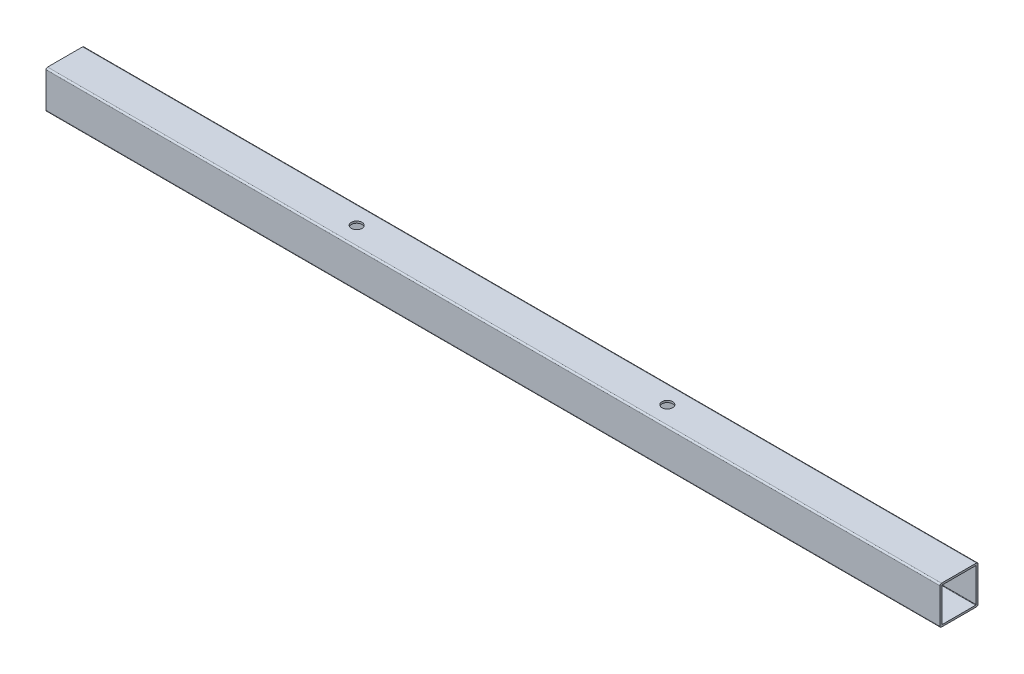
ISO-10303-21;
HEADER;
FILE_DESCRIPTION(('STEP AP214'),'2;1');
FILE_NAME('part.step','',(''),(''),'','','');
FILE_SCHEMA(('AUTOMOTIVE_DESIGN { 1 0 10303 214 1 1 1 1 }'));
ENDSEC;
DATA;
#1=APPLICATION_CONTEXT('core data for automotive mechanical design processes');
#2=APPLICATION_PROTOCOL_DEFINITION('international standard','automotive_design',2000,#1);
#3=PRODUCT_CONTEXT('',#1,'mechanical');
#4=PRODUCT('Part','Part','',(#3));
#5=PRODUCT_RELATED_PRODUCT_CATEGORY('part','',(#4));
#6=PRODUCT_DEFINITION_FORMATION('','',#4);
#7=PRODUCT_DEFINITION_CONTEXT('part definition',#1,'design');
#8=PRODUCT_DEFINITION('design','',#6,#7);
#9=PRODUCT_DEFINITION_SHAPE('','',#8);
#10=(LENGTH_UNIT() NAMED_UNIT(*) SI_UNIT(.MILLI.,.METRE.));
#11=(NAMED_UNIT(*) PLANE_ANGLE_UNIT() SI_UNIT($,.RADIAN.));
#12=(NAMED_UNIT(*) SI_UNIT($,.STERADIAN.) SOLID_ANGLE_UNIT());
#13=UNCERTAINTY_MEASURE_WITH_UNIT(LENGTH_MEASURE(1.E-05),#10,'distance_accuracy_value','');
#14=(GEOMETRIC_REPRESENTATION_CONTEXT(3) GLOBAL_UNCERTAINTY_ASSIGNED_CONTEXT((#13)) GLOBAL_UNIT_ASSIGNED_CONTEXT((#10,
#11,#12)) REPRESENTATION_CONTEXT('',''));
#15=CARTESIAN_POINT('',(0.,0.,0.));
#16=DIRECTION('',(0.,0.,1.));
#17=DIRECTION('',(1.,0.,0.));
#18=AXIS2_PLACEMENT_3D('',#15,#16,#17);
#19=CARTESIAN_POINT('',(-1275.,100.,825.));
#20=DIRECTION('',(0.,0.,-1.));
#21=DIRECTION('',(-1.,0.,0.));
#22=AXIS2_PLACEMENT_3D('',#19,#20,#21);
#23=PLANE('',#22);
#24=DIRECTION('',(1.,0.,0.));
#25=VECTOR('',#24,1.);
#26=CARTESIAN_POINT('',(1175.,96.,825.));
#27=LINE('',#26,#25);
#28=CARTESIAN_POINT('',(-1175.,96.,825.));
#29=VERTEX_POINT('',#28);
#30=CARTESIAN_POINT('',(1175.,96.,825.));
#31=VERTEX_POINT('',#30);
#32=EDGE_CURVE('E351',#29,#31,#27,.T.);
#33=ORIENTED_EDGE('',*,*,#32,.T.);
#34=DIRECTION('',(0.,1.,0.));
#35=VECTOR('',#34,1.);
#36=CARTESIAN_POINT('',(1175.,100.,825.));
#37=LINE('',#36,#35);
#38=CARTESIAN_POINT('',(1175.,4.,825.));
#39=VERTEX_POINT('',#38);
#40=EDGE_CURVE('E223',#31,#39,#37,.F.);
#41=ORIENTED_EDGE('',*,*,#40,.T.);
#42=DIRECTION('',(1.,0.,0.));
#43=VECTOR('',#42,1.);
#44=CARTESIAN_POINT('',(-1275.,4.,825.));
#45=LINE('',#44,#43);
#46=CARTESIAN_POINT('',(-1175.,4.,825.));
#47=VERTEX_POINT('',#46);
#48=EDGE_CURVE('E354',#39,#47,#45,.F.);
#49=ORIENTED_EDGE('',*,*,#48,.T.);
#50=DIRECTION('',(0.,1.,0.));
#51=VECTOR('',#50,1.);
#52=CARTESIAN_POINT('',(-1175.,100.,825.));
#53=LINE('',#52,#51);
#54=EDGE_CURVE('E230',#47,#29,#53,.T.);
#55=ORIENTED_EDGE('',*,*,#54,.T.);
#56=EDGE_LOOP('',(#33,#41,#49,#55));
#57=FACE_BOUND('',#56,.T.);
#58=ADVANCED_FACE('F19',(#57),#23,.T.);
#59=CARTESIAN_POINT('',(-1175.,100.,825.));
#60=DIRECTION('',(1.,0.,0.));
#61=DIRECTION('',(0.,0.,-1.));
#62=AXIS2_PLACEMENT_3D('',#59,#60,#61);
#63=PLANE('',#62);
#64=DIRECTION('',(0.,1.,0.));
#65=VECTOR('',#64,1.);
#66=CARTESIAN_POINT('',(-1175.,100.,830.));
#67=LINE('',#66,#65);
#68=CARTESIAN_POINT('',(-1175.,6.00000000000001,830.));
#69=VERTEX_POINT('',#68);
#70=CARTESIAN_POINT('',(-1175.,94.,830.));
#71=VERTEX_POINT('',#70);
#72=EDGE_CURVE('E244',#69,#71,#67,.T.);
#73=ORIENTED_EDGE('',*,*,#72,.T.);
#74=CARTESIAN_POINT('',(-1175.,94.,831.));
#75=DIRECTION('',(1.,0.,0.));
#76=DIRECTION('',(0.,0.,-1.));
#77=AXIS2_PLACEMENT_3D('',#74,#75,#76);
#78=CIRCLE('',#77,1.);
#79=CARTESIAN_POINT('',(-1175.,95.,831.));
#80=VERTEX_POINT('',#79);
#81=EDGE_CURVE('E318',#71,#80,#78,.T.);
#82=ORIENTED_EDGE('',*,*,#81,.T.);
#83=DIRECTION('',(0.,0.,1.));
#84=VECTOR('',#83,1.);
#85=CARTESIAN_POINT('',(-1175.,95.,825.));
#86=LINE('',#85,#84);
#87=CARTESIAN_POINT('',(-1175.,95.,919.));
#88=VERTEX_POINT('',#87);
#89=EDGE_CURVE('E242',#80,#88,#86,.T.);
#90=ORIENTED_EDGE('',*,*,#89,.T.);
#91=CARTESIAN_POINT('',(-1175.,94.,919.));
#92=DIRECTION('',(1.,0.,0.));
#93=DIRECTION('',(0.,0.,-1.));
#94=AXIS2_PLACEMENT_3D('',#91,#92,#93);
#95=CIRCLE('',#94,1.);
#96=CARTESIAN_POINT('',(-1175.,94.,920.));
#97=VERTEX_POINT('',#96);
#98=EDGE_CURVE('E324',#88,#97,#95,.T.);
#99=ORIENTED_EDGE('',*,*,#98,.T.);
#100=DIRECTION('',(0.,-1.,0.));
#101=VECTOR('',#100,1.);
#102=CARTESIAN_POINT('',(-1175.,100.,920.));
#103=LINE('',#102,#101);
#104=CARTESIAN_POINT('',(-1175.,6.00000000000001,920.));
#105=VERTEX_POINT('',#104);
#106=EDGE_CURVE('E239',#97,#105,#103,.T.);
#107=ORIENTED_EDGE('',*,*,#106,.T.);
#108=CARTESIAN_POINT('',(-1175.,6.,919.));
#109=DIRECTION('',(1.,0.,0.));
#110=DIRECTION('',(0.,0.,-1.));
#111=AXIS2_PLACEMENT_3D('',#108,#109,#110);
#112=CIRCLE('',#111,1.);
#113=CARTESIAN_POINT('',(-1175.,5.,919.));
#114=VERTEX_POINT('',#113);
#115=EDGE_CURVE('E330',#105,#114,#112,.T.);
#116=ORIENTED_EDGE('',*,*,#115,.T.);
#117=DIRECTION('',(0.,0.,-1.));
#118=VECTOR('',#117,1.);
#119=CARTESIAN_POINT('',(-1175.,5.,825.));
#120=LINE('',#119,#118);
#121=CARTESIAN_POINT('',(-1175.,5.,831.));
#122=VERTEX_POINT('',#121);
#123=EDGE_CURVE('E246',#114,#122,#120,.T.);
#124=ORIENTED_EDGE('',*,*,#123,.T.);
#125=CARTESIAN_POINT('',(-1175.,6.,831.));
#126=DIRECTION('',(1.,0.,0.));
#127=DIRECTION('',(0.,0.,-1.));
#128=AXIS2_PLACEMENT_3D('',#125,#126,#127);
#129=CIRCLE('',#128,1.);
#130=EDGE_CURVE('E12',#122,#69,#129,.T.);
#131=ORIENTED_EDGE('',*,*,#130,.T.);
#132=EDGE_LOOP('',(#73,#82,#90,#99,#107,#116,#124,#131));
#133=FACE_BOUND('',#132,.T.);
#134=DIRECTION('',(0.,0.,1.));
#135=VECTOR('',#134,1.);
#136=CARTESIAN_POINT('',(-1175.,0.,0.));
#137=LINE('',#136,#135);
#138=CARTESIAN_POINT('',(-1175.,0.,829.));
#139=VERTEX_POINT('',#138);
#140=CARTESIAN_POINT('',(-1175.,0.,921.));
#141=VERTEX_POINT('',#140);
#142=EDGE_CURVE('E138',#139,#141,#137,.T.);
#143=ORIENTED_EDGE('',*,*,#142,.T.);
#144=CARTESIAN_POINT('',(-1175.,4.,921.));
#145=DIRECTION('',(1.,0.,0.));
#146=DIRECTION('',(0.,0.,-1.));
#147=AXIS2_PLACEMENT_3D('',#144,#145,#146);
#148=CIRCLE('',#147,4.);
#149=CARTESIAN_POINT('',(-1175.,4.,925.));
#150=VERTEX_POINT('',#149);
#151=EDGE_CURVE('E133',#141,#150,#148,.F.);
#152=ORIENTED_EDGE('',*,*,#151,.T.);
#153=DIRECTION('',(0.,1.,0.));
#154=VECTOR('',#153,1.);
#155=CARTESIAN_POINT('',(-1175.,600.,925.));
#156=LINE('',#155,#154);
#157=CARTESIAN_POINT('',(-1175.,96.,925.));
#158=VERTEX_POINT('',#157);
#159=EDGE_CURVE('E136',#150,#158,#156,.T.);
#160=ORIENTED_EDGE('',*,*,#159,.T.);
#161=CARTESIAN_POINT('',(-1175.,96.,921.));
#162=DIRECTION('',(1.,0.,0.));
#163=DIRECTION('',(0.,0.,-1.));
#164=AXIS2_PLACEMENT_3D('',#161,#162,#163);
#165=CIRCLE('',#164,4.);
#166=CARTESIAN_POINT('',(-1175.,100.,921.));
#167=VERTEX_POINT('',#166);
#168=EDGE_CURVE('E143',#158,#167,#165,.F.);
#169=ORIENTED_EDGE('',*,*,#168,.T.);
#170=DIRECTION('',(0.,0.,-1.));
#171=VECTOR('',#170,1.);
#172=CARTESIAN_POINT('',(-1175.,100.,0.));
#173=LINE('',#172,#171);
#174=CARTESIAN_POINT('',(-1175.,100.,829.));
#175=VERTEX_POINT('',#174);
#176=EDGE_CURVE('E224',#167,#175,#173,.T.);
#177=ORIENTED_EDGE('',*,*,#176,.T.);
#178=CARTESIAN_POINT('',(-1175.,96.,829.));
#179=DIRECTION('',(1.,0.,0.));
#180=DIRECTION('',(0.,0.,-1.));
#181=AXIS2_PLACEMENT_3D('',#178,#179,#180);
#182=CIRCLE('',#181,4.);
#183=EDGE_CURVE('E360',#175,#29,#182,.F.);
#184=ORIENTED_EDGE('',*,*,#183,.T.);
#185=ORIENTED_EDGE('',*,*,#54,.F.);
#186=CARTESIAN_POINT('',(-1175.,4.,829.));
#187=DIRECTION('',(1.,0.,0.));
#188=DIRECTION('',(0.,0.,-1.));
#189=AXIS2_PLACEMENT_3D('',#186,#187,#188);
#190=CIRCLE('',#189,4.);
#191=EDGE_CURVE('E363',#47,#139,#190,.F.);
#192=ORIENTED_EDGE('',*,*,#191,.T.);
#193=EDGE_LOOP('',(#143,#152,#160,#169,#177,#184,#185,#192));
#194=FACE_BOUND('',#193,.T.);
#195=ADVANCED_FACE('F135',(#133,#194),#63,.F.);
#196=CARTESIAN_POINT('',(1175.,100.,-825.));
#197=DIRECTION('',(-1.,0.,0.));
#198=DIRECTION('',(0.,0.,1.));
#199=AXIS2_PLACEMENT_3D('',#196,#197,#198);
#200=PLANE('',#199);
#201=DIRECTION('',(0.,-1.,0.));
#202=VECTOR('',#201,1.);
#203=CARTESIAN_POINT('',(1175.,100.,830.));
#204=LINE('',#203,#202);
#205=CARTESIAN_POINT('',(1175.,94.,830.));
#206=VERTEX_POINT('',#205);
#207=CARTESIAN_POINT('',(1175.,6.00000000000001,830.));
#208=VERTEX_POINT('',#207);
#209=EDGE_CURVE('E216',#206,#208,#204,.T.);
#210=ORIENTED_EDGE('',*,*,#209,.T.);
#211=CARTESIAN_POINT('',(1175.,6.,831.));
#212=DIRECTION('',(-1.,0.,0.));
#213=DIRECTION('',(0.,0.,1.));
#214=AXIS2_PLACEMENT_3D('',#211,#212,#213);
#215=CIRCLE('',#214,1.);
#216=CARTESIAN_POINT('',(1175.,5.,831.));
#217=VERTEX_POINT('',#216);
#218=EDGE_CURVE('E27',#208,#217,#215,.T.);
#219=ORIENTED_EDGE('',*,*,#218,.T.);
#220=DIRECTION('',(0.,0.,1.));
#221=VECTOR('',#220,1.);
#222=CARTESIAN_POINT('',(1175.,5.,-825.));
#223=LINE('',#222,#221);
#224=CARTESIAN_POINT('',(1175.,5.,919.));
#225=VERTEX_POINT('',#224);
#226=EDGE_CURVE('E220',#217,#225,#223,.T.);
#227=ORIENTED_EDGE('',*,*,#226,.T.);
#228=CARTESIAN_POINT('',(1175.,6.,919.));
#229=DIRECTION('',(-1.,0.,0.));
#230=DIRECTION('',(0.,0.,1.));
#231=AXIS2_PLACEMENT_3D('',#228,#229,#230);
#232=CIRCLE('',#231,1.);
#233=CARTESIAN_POINT('',(1175.,6.00000000000001,920.));
#234=VERTEX_POINT('',#233);
#235=EDGE_CURVE('E332',#225,#234,#232,.T.);
#236=ORIENTED_EDGE('',*,*,#235,.T.);
#237=DIRECTION('',(0.,1.,0.));
#238=VECTOR('',#237,1.);
#239=CARTESIAN_POINT('',(1175.,100.,920.));
#240=LINE('',#239,#238);
#241=CARTESIAN_POINT('',(1175.,94.,920.));
#242=VERTEX_POINT('',#241);
#243=EDGE_CURVE('E163',#234,#242,#240,.T.);
#244=ORIENTED_EDGE('',*,*,#243,.T.);
#245=CARTESIAN_POINT('',(1175.,94.,919.));
#246=DIRECTION('',(-1.,0.,0.));
#247=DIRECTION('',(0.,0.,1.));
#248=AXIS2_PLACEMENT_3D('',#245,#246,#247);
#249=CIRCLE('',#248,1.);
#250=CARTESIAN_POINT('',(1175.,95.,919.));
#251=VERTEX_POINT('',#250);
#252=EDGE_CURVE('E328',#242,#251,#249,.T.);
#253=ORIENTED_EDGE('',*,*,#252,.T.);
#254=DIRECTION('',(0.,0.,-1.));
#255=VECTOR('',#254,1.);
#256=CARTESIAN_POINT('',(1175.,95.,-825.));
#257=LINE('',#256,#255);
#258=CARTESIAN_POINT('',(1175.,95.,831.));
#259=VERTEX_POINT('',#258);
#260=EDGE_CURVE('E210',#251,#259,#257,.T.);
#261=ORIENTED_EDGE('',*,*,#260,.T.);
#262=CARTESIAN_POINT('',(1175.,94.,831.));
#263=DIRECTION('',(-1.,0.,0.));
#264=DIRECTION('',(0.,0.,1.));
#265=AXIS2_PLACEMENT_3D('',#262,#263,#264);
#266=CIRCLE('',#265,1.);
#267=EDGE_CURVE('E322',#259,#206,#266,.T.);
#268=ORIENTED_EDGE('',*,*,#267,.T.);
#269=EDGE_LOOP('',(#210,#219,#227,#236,#244,#253,#261,#268));
#270=FACE_BOUND('',#269,.T.);
#271=DIRECTION('',(0.,-1.,0.));
#272=VECTOR('',#271,1.);
#273=CARTESIAN_POINT('',(1175.,600.,925.));
#274=LINE('',#273,#272);
#275=CARTESIAN_POINT('',(1175.,96.,925.));
#276=VERTEX_POINT('',#275);
#277=CARTESIAN_POINT('',(1175.,4.,925.));
#278=VERTEX_POINT('',#277);
#279=EDGE_CURVE('E155',#276,#278,#274,.T.);
#280=ORIENTED_EDGE('',*,*,#279,.T.);
#281=CARTESIAN_POINT('',(1175.,4.,921.));
#282=DIRECTION('',(-1.,0.,0.));
#283=DIRECTION('',(0.,0.,1.));
#284=AXIS2_PLACEMENT_3D('',#281,#282,#283);
#285=CIRCLE('',#284,4.);
#286=CARTESIAN_POINT('',(1175.,0.,921.));
#287=VERTEX_POINT('',#286);
#288=EDGE_CURVE('E158',#278,#287,#285,.F.);
#289=ORIENTED_EDGE('',*,*,#288,.T.);
#290=DIRECTION('',(0.,0.,-1.));
#291=VECTOR('',#290,1.);
#292=CARTESIAN_POINT('',(1175.,0.,0.));
#293=LINE('',#292,#291);
#294=CARTESIAN_POINT('',(1175.,0.,829.));
#295=VERTEX_POINT('',#294);
#296=EDGE_CURVE('E154',#287,#295,#293,.T.);
#297=ORIENTED_EDGE('',*,*,#296,.T.);
#298=CARTESIAN_POINT('',(1175.,4.,829.));
#299=DIRECTION('',(-1.,0.,0.));
#300=DIRECTION('',(0.,0.,1.));
#301=AXIS2_PLACEMENT_3D('',#298,#299,#300);
#302=CIRCLE('',#301,4.);
#303=EDGE_CURVE('E159',#295,#39,#302,.F.);
#304=ORIENTED_EDGE('',*,*,#303,.T.);
#305=ORIENTED_EDGE('',*,*,#40,.F.);
#306=CARTESIAN_POINT('',(1175.,96.,829.));
#307=DIRECTION('',(-1.,0.,0.));
#308=DIRECTION('',(0.,0.,1.));
#309=AXIS2_PLACEMENT_3D('',#306,#307,#308);
#310=CIRCLE('',#309,4.);
#311=CARTESIAN_POINT('',(1175.,100.,829.));
#312=VERTEX_POINT('',#311);
#313=EDGE_CURVE('E161',#31,#312,#310,.F.);
#314=ORIENTED_EDGE('',*,*,#313,.T.);
#315=DIRECTION('',(0.,0.,-1.));
#316=VECTOR('',#315,1.);
#317=CARTESIAN_POINT('',(1175.,100.,0.));
#318=LINE('',#317,#316);
#319=CARTESIAN_POINT('',(1175.,100.,921.));
#320=VERTEX_POINT('',#319);
#321=EDGE_CURVE('E226',#312,#320,#318,.F.);
#322=ORIENTED_EDGE('',*,*,#321,.T.);
#323=CARTESIAN_POINT('',(1175.,96.,921.));
#324=DIRECTION('',(-1.,0.,0.));
#325=DIRECTION('',(0.,0.,1.));
#326=AXIS2_PLACEMENT_3D('',#323,#324,#325);
#327=CIRCLE('',#326,4.);
#328=EDGE_CURVE('E371',#320,#276,#327,.F.);
#329=ORIENTED_EDGE('',*,*,#328,.T.);
#330=EDGE_LOOP('',(#280,#289,#297,#304,#305,#314,#322,#329));
#331=FACE_BOUND('',#330,.T.);
#332=ADVANCED_FACE('F376',(#270,#331),#200,.F.);
#333=CARTESIAN_POINT('',(1175.,600.,925.));
#334=DIRECTION('',(0.,0.,1.));
#335=DIRECTION('',(1.,0.,0.));
#336=AXIS2_PLACEMENT_3D('',#333,#334,#335);
#337=PLANE('',#336);
#338=ORIENTED_EDGE('',*,*,#159,.F.);
#339=DIRECTION('',(1.,0.,0.));
#340=VECTOR('',#339,1.);
#341=CARTESIAN_POINT('',(1175.,4.,925.));
#342=LINE('',#341,#340);
#343=EDGE_CURVE('E150',#150,#278,#342,.T.);
#344=ORIENTED_EDGE('',*,*,#343,.T.);
#345=ORIENTED_EDGE('',*,*,#279,.F.);
#346=DIRECTION('',(-1.,0.,0.));
#347=VECTOR('',#346,1.);
#348=CARTESIAN_POINT('',(-1175.,96.,925.));
#349=LINE('',#348,#347);
#350=EDGE_CURVE('E153',#276,#158,#349,.T.);
#351=ORIENTED_EDGE('',*,*,#350,.T.);
#352=EDGE_LOOP('',(#338,#344,#345,#351));
#353=FACE_BOUND('',#352,.T.);
#354=ADVANCED_FACE('F148',(#353),#337,.T.);
#355=CARTESIAN_POINT('',(0.,100.,0.));
#356=DIRECTION('',(0.,-1.,0.));
#357=DIRECTION('',(0.,0.,-1.));
#358=AXIS2_PLACEMENT_3D('',#355,#356,#357);
#359=PLANE('',#358);
#360=CARTESIAN_POINT('',(-408.3,100.,875.));
#361=DIRECTION('',(0.,-1.,0.));
#362=DIRECTION('',(0.,0.,-1.));
#363=AXIS2_PLACEMENT_3D('',#360,#361,#362);
#364=CIRCLE('',#363,14.);
#365=CARTESIAN_POINT('',(-408.3,100.,861.));
#366=VERTEX_POINT('',#365);
#367=EDGE_CURVE('E194',#366,#366,#364,.T.);
#368=ORIENTED_EDGE('',*,*,#367,.T.);
#369=EDGE_LOOP('',(#368));
#370=FACE_BOUND('',#369,.T.);
#371=CARTESIAN_POINT('',(408.3,100.,875.));
#372=DIRECTION('',(0.,-1.,0.));
#373=DIRECTION('',(0.,0.,-1.));
#374=AXIS2_PLACEMENT_3D('',#371,#372,#373);
#375=CIRCLE('',#374,14.);
#376=CARTESIAN_POINT('',(408.3,100.,861.));
#377=VERTEX_POINT('',#376);
#378=EDGE_CURVE('E184',#377,#377,#375,.T.);
#379=ORIENTED_EDGE('',*,*,#378,.T.);
#380=EDGE_LOOP('',(#379));
#381=FACE_BOUND('',#380,.T.);
#382=ORIENTED_EDGE('',*,*,#176,.F.);
#383=DIRECTION('',(-1.,0.,0.));
#384=VECTOR('',#383,1.);
#385=CARTESIAN_POINT('',(1175.,100.,921.));
#386=LINE('',#385,#384);
#387=EDGE_CURVE('E356',#167,#320,#386,.F.);
#388=ORIENTED_EDGE('',*,*,#387,.T.);
#389=ORIENTED_EDGE('',*,*,#321,.F.);
#390=DIRECTION('',(1.,0.,0.));
#391=VECTOR('',#390,1.);
#392=CARTESIAN_POINT('',(-1175.,100.,829.));
#393=LINE('',#392,#391);
#394=EDGE_CURVE('E142',#312,#175,#393,.F.);
#395=ORIENTED_EDGE('',*,*,#394,.T.);
#396=EDGE_LOOP('',(#382,#388,#389,#395));
#397=FACE_BOUND('',#396,.T.);
#398=ADVANCED_FACE('F251',(#370,#381,#397),#359,.F.);
#399=CARTESIAN_POINT('',(0.,0.,0.));
#400=DIRECTION('',(0.,-1.,0.));
#401=DIRECTION('',(0.,0.,-1.));
#402=AXIS2_PLACEMENT_3D('',#399,#400,#401);
#403=PLANE('',#402);
#404=CARTESIAN_POINT('',(-408.3,0.,875.));
#405=DIRECTION('',(0.,-1.,0.));
#406=DIRECTION('',(0.,0.,-1.));
#407=AXIS2_PLACEMENT_3D('',#404,#405,#406);
#408=CIRCLE('',#407,14.);
#409=CARTESIAN_POINT('',(-408.3,0.,861.));
#410=VERTEX_POINT('',#409);
#411=EDGE_CURVE('E180',#410,#410,#408,.T.);
#412=ORIENTED_EDGE('',*,*,#411,.F.);
#413=EDGE_LOOP('',(#412));
#414=FACE_BOUND('',#413,.T.);
#415=CARTESIAN_POINT('',(408.3,0.,875.));
#416=DIRECTION('',(0.,-1.,0.));
#417=DIRECTION('',(0.,0.,-1.));
#418=AXIS2_PLACEMENT_3D('',#415,#416,#417);
#419=CIRCLE('',#418,14.);
#420=CARTESIAN_POINT('',(408.3,0.,861.));
#421=VERTEX_POINT('',#420);
#422=EDGE_CURVE('E175',#421,#421,#419,.T.);
#423=ORIENTED_EDGE('',*,*,#422,.F.);
#424=EDGE_LOOP('',(#423));
#425=FACE_BOUND('',#424,.T.);
#426=ORIENTED_EDGE('',*,*,#296,.F.);
#427=DIRECTION('',(1.,0.,0.));
#428=VECTOR('',#427,1.);
#429=CARTESIAN_POINT('',(0.,0.,921.));
#430=LINE('',#429,#428);
#431=EDGE_CURVE('E365',#287,#141,#430,.F.);
#432=ORIENTED_EDGE('',*,*,#431,.T.);
#433=ORIENTED_EDGE('',*,*,#142,.F.);
#434=DIRECTION('',(1.,0.,0.));
#435=VECTOR('',#434,1.);
#436=CARTESIAN_POINT('',(0.,0.,829.));
#437=LINE('',#436,#435);
#438=EDGE_CURVE('E366',#139,#295,#437,.T.);
#439=ORIENTED_EDGE('',*,*,#438,.T.);
#440=EDGE_LOOP('',(#426,#432,#433,#439));
#441=FACE_BOUND('',#440,.T.);
#442=ADVANCED_FACE('F273',(#414,#425,#441),#403,.T.);
#443=CARTESIAN_POINT('',(-1275.,95.,920.));
#444=DIRECTION('',(0.,0.,1.));
#445=DIRECTION('',(1.,0.,0.));
#446=AXIS2_PLACEMENT_3D('',#443,#444,#445);
#447=PLANE('',#446);
#448=ORIENTED_EDGE('',*,*,#243,.F.);
#449=DIRECTION('',(1.,0.,0.));
#450=VECTOR('',#449,1.);
#451=CARTESIAN_POINT('',(-1175.,6.,920.));
#452=LINE('',#451,#450);
#453=EDGE_CURVE('E341',#234,#105,#452,.F.);
#454=ORIENTED_EDGE('',*,*,#453,.T.);
#455=ORIENTED_EDGE('',*,*,#106,.F.);
#456=DIRECTION('',(1.,0.,0.));
#457=VECTOR('',#456,1.);
#458=CARTESIAN_POINT('',(1175.,94.,920.));
#459=LINE('',#458,#457);
#460=EDGE_CURVE('E343',#97,#242,#459,.T.);
#461=ORIENTED_EDGE('',*,*,#460,.T.);
#462=EDGE_LOOP('',(#448,#454,#455,#461));
#463=FACE_BOUND('',#462,.T.);
#464=ADVANCED_FACE('F275',(#463),#447,.F.);
#465=CARTESIAN_POINT('',(-1275.,95.,830.));
#466=DIRECTION('',(0.,1.,0.));
#467=DIRECTION('',(0.,0.,1.));
#468=AXIS2_PLACEMENT_3D('',#465,#466,#467);
#469=PLANE('',#468);
#470=CARTESIAN_POINT('',(-408.3,95.,875.));
#471=DIRECTION('',(0.,1.,0.));
#472=DIRECTION('',(0.,0.,1.));
#473=AXIS2_PLACEMENT_3D('',#470,#471,#472);
#474=CIRCLE('',#473,14.);
#475=CARTESIAN_POINT('',(-408.3,95.,889.));
#476=VERTEX_POINT('',#475);
#477=EDGE_CURVE('E190',#476,#476,#474,.T.);
#478=ORIENTED_EDGE('',*,*,#477,.T.);
#479=EDGE_LOOP('',(#478));
#480=FACE_BOUND('',#479,.T.);
#481=CARTESIAN_POINT('',(408.3,95.,875.));
#482=DIRECTION('',(0.,1.,0.));
#483=DIRECTION('',(0.,0.,1.));
#484=AXIS2_PLACEMENT_3D('',#481,#482,#483);
#485=CIRCLE('',#484,14.);
#486=CARTESIAN_POINT('',(408.3,95.,889.));
#487=VERTEX_POINT('',#486);
#488=EDGE_CURVE('E182',#487,#487,#485,.T.);
#489=ORIENTED_EDGE('',*,*,#488,.T.);
#490=EDGE_LOOP('',(#489));
#491=FACE_BOUND('',#490,.T.);
#492=ORIENTED_EDGE('',*,*,#260,.F.);
#493=DIRECTION('',(1.,0.,0.));
#494=VECTOR('',#493,1.);
#495=CARTESIAN_POINT('',(-1175.,95.,919.));
#496=LINE('',#495,#494);
#497=EDGE_CURVE('E338',#251,#88,#496,.F.);
#498=ORIENTED_EDGE('',*,*,#497,.T.);
#499=ORIENTED_EDGE('',*,*,#89,.F.);
#500=DIRECTION('',(1.,0.,0.));
#501=VECTOR('',#500,1.);
#502=CARTESIAN_POINT('',(1175.,95.,831.));
#503=LINE('',#502,#501);
#504=EDGE_CURVE('E320',#80,#259,#503,.T.);
#505=ORIENTED_EDGE('',*,*,#504,.T.);
#506=EDGE_LOOP('',(#492,#498,#499,#505));
#507=FACE_BOUND('',#506,.T.);
#508=ADVANCED_FACE('F282',(#480,#491,#507),#469,.F.);
#509=CARTESIAN_POINT('',(-1275.,5.,830.));
#510=DIRECTION('',(0.,0.,-1.));
#511=DIRECTION('',(-1.,0.,0.));
#512=AXIS2_PLACEMENT_3D('',#509,#510,#511);
#513=PLANE('',#512);
#514=ORIENTED_EDGE('',*,*,#209,.F.);
#515=DIRECTION('',(1.,0.,0.));
#516=VECTOR('',#515,1.);
#517=CARTESIAN_POINT('',(-1175.,94.,830.));
#518=LINE('',#517,#516);
#519=EDGE_CURVE('E34',#206,#71,#518,.F.);
#520=ORIENTED_EDGE('',*,*,#519,.T.);
#521=ORIENTED_EDGE('',*,*,#72,.F.);
#522=DIRECTION('',(1.,0.,0.));
#523=VECTOR('',#522,1.);
#524=CARTESIAN_POINT('',(1175.,6.,830.));
#525=LINE('',#524,#523);
#526=EDGE_CURVE('E335',#69,#208,#525,.T.);
#527=ORIENTED_EDGE('',*,*,#526,.T.);
#528=EDGE_LOOP('',(#514,#520,#521,#527));
#529=FACE_BOUND('',#528,.T.);
#530=ADVANCED_FACE('F404',(#529),#513,.F.);
#531=CARTESIAN_POINT('',(-1275.,5.,920.));
#532=DIRECTION('',(0.,-1.,0.));
#533=DIRECTION('',(0.,0.,-1.));
#534=AXIS2_PLACEMENT_3D('',#531,#532,#533);
#535=PLANE('',#534);
#536=CARTESIAN_POINT('',(-408.3,5.,875.));
#537=DIRECTION('',(0.,-1.,0.));
#538=DIRECTION('',(0.,0.,-1.));
#539=AXIS2_PLACEMENT_3D('',#536,#537,#538);
#540=CIRCLE('',#539,14.);
#541=CARTESIAN_POINT('',(-408.3,5.,861.));
#542=VERTEX_POINT('',#541);
#543=EDGE_CURVE('E189',#542,#542,#540,.T.);
#544=ORIENTED_EDGE('',*,*,#543,.T.);
#545=EDGE_LOOP('',(#544));
#546=FACE_BOUND('',#545,.T.);
#547=CARTESIAN_POINT('',(408.3,5.,875.));
#548=DIRECTION('',(0.,-1.,0.));
#549=DIRECTION('',(0.,0.,-1.));
#550=AXIS2_PLACEMENT_3D('',#547,#548,#549);
#551=CIRCLE('',#550,14.);
#552=CARTESIAN_POINT('',(408.3,5.,861.));
#553=VERTEX_POINT('',#552);
#554=EDGE_CURVE('E185',#553,#553,#551,.T.);
#555=ORIENTED_EDGE('',*,*,#554,.T.);
#556=EDGE_LOOP('',(#555));
#557=FACE_BOUND('',#556,.T.);
#558=ORIENTED_EDGE('',*,*,#123,.F.);
#559=DIRECTION('',(1.,0.,0.));
#560=VECTOR('',#559,1.);
#561=CARTESIAN_POINT('',(1175.,5.,919.));
#562=LINE('',#561,#560);
#563=EDGE_CURVE('E346',#114,#225,#562,.T.);
#564=ORIENTED_EDGE('',*,*,#563,.T.);
#565=ORIENTED_EDGE('',*,*,#226,.F.);
#566=DIRECTION('',(1.,0.,0.));
#567=VECTOR('',#566,1.);
#568=CARTESIAN_POINT('',(-1175.,5.,831.));
#569=LINE('',#568,#567);
#570=EDGE_CURVE('E349',#217,#122,#569,.F.);
#571=ORIENTED_EDGE('',*,*,#570,.T.);
#572=EDGE_LOOP('',(#558,#564,#565,#571));
#573=FACE_BOUND('',#572,.T.);
#574=ADVANCED_FACE('F401',(#546,#557,#573),#535,.F.);
#575=CARTESIAN_POINT('',(408.3,130.,875.));
#576=DIRECTION('',(0.,-1.,0.));
#577=DIRECTION('',(0.,0.,-1.));
#578=AXIS2_PLACEMENT_3D('',#575,#576,#577);
#579=CYLINDRICAL_SURFACE('',#578,14.);
#580=ORIENTED_EDGE('',*,*,#422,.T.);
#581=EDGE_LOOP('',(#580));
#582=FACE_BOUND('',#581,.T.);
#583=ORIENTED_EDGE('',*,*,#554,.F.);
#584=EDGE_LOOP('',(#583));
#585=FACE_BOUND('',#584,.T.);
#586=ADVANCED_FACE('F269',(#582,#585),#579,.F.);
#587=CARTESIAN_POINT('',(-408.3,130.,875.));
#588=DIRECTION('',(0.,-1.,0.));
#589=DIRECTION('',(0.,0.,-1.));
#590=AXIS2_PLACEMENT_3D('',#587,#588,#589);
#591=CYLINDRICAL_SURFACE('',#590,14.);
#592=ORIENTED_EDGE('',*,*,#411,.T.);
#593=EDGE_LOOP('',(#592));
#594=FACE_BOUND('',#593,.T.);
#595=ORIENTED_EDGE('',*,*,#543,.F.);
#596=EDGE_LOOP('',(#595));
#597=FACE_BOUND('',#596,.T.);
#598=ADVANCED_FACE('F259',(#594,#597),#591,.F.);
#599=ORIENTED_EDGE('',*,*,#488,.F.);
#600=EDGE_LOOP('',(#599));
#601=FACE_BOUND('',#600,.T.);
#602=ORIENTED_EDGE('',*,*,#378,.F.);
#603=EDGE_LOOP('',(#602));
#604=FACE_BOUND('',#603,.T.);
#605=ADVANCED_FACE('F256',(#601,#604),#579,.F.);
#606=ORIENTED_EDGE('',*,*,#477,.F.);
#607=EDGE_LOOP('',(#606));
#608=FACE_BOUND('',#607,.T.);
#609=ORIENTED_EDGE('',*,*,#367,.F.);
#610=EDGE_LOOP('',(#609));
#611=FACE_BOUND('',#610,.T.);
#612=ADVANCED_FACE('F254',(#608,#611),#591,.F.);
#613=CARTESIAN_POINT('',(1175.,4.,921.));
#614=DIRECTION('',(1.,0.,0.));
#615=DIRECTION('',(0.,0.,-1.));
#616=AXIS2_PLACEMENT_3D('',#613,#614,#615);
#617=CYLINDRICAL_SURFACE('',#616,4.);
#618=ORIENTED_EDGE('',*,*,#151,.F.);
#619=ORIENTED_EDGE('',*,*,#431,.F.);
#620=ORIENTED_EDGE('',*,*,#288,.F.);
#621=ORIENTED_EDGE('',*,*,#343,.F.);
#622=EDGE_LOOP('',(#618,#619,#620,#621));
#623=FACE_BOUND('',#622,.T.);
#624=ADVANCED_FACE('F157',(#623),#617,.T.);
#625=CARTESIAN_POINT('',(1175.,96.,921.));
#626=DIRECTION('',(1.,0.,0.));
#627=DIRECTION('',(0.,0.,-1.));
#628=AXIS2_PLACEMENT_3D('',#625,#626,#627);
#629=CYLINDRICAL_SURFACE('',#628,4.);
#630=ORIENTED_EDGE('',*,*,#328,.F.);
#631=ORIENTED_EDGE('',*,*,#387,.F.);
#632=ORIENTED_EDGE('',*,*,#168,.F.);
#633=ORIENTED_EDGE('',*,*,#350,.F.);
#634=EDGE_LOOP('',(#630,#631,#632,#633));
#635=FACE_BOUND('',#634,.T.);
#636=ADVANCED_FACE('F265',(#635),#629,.T.);
#637=CARTESIAN_POINT('',(-1275.,96.,829.));
#638=DIRECTION('',(-1.,0.,0.));
#639=DIRECTION('',(0.,0.,1.));
#640=AXIS2_PLACEMENT_3D('',#637,#638,#639);
#641=CYLINDRICAL_SURFACE('',#640,4.);
#642=ORIENTED_EDGE('',*,*,#183,.F.);
#643=ORIENTED_EDGE('',*,*,#394,.F.);
#644=ORIENTED_EDGE('',*,*,#313,.F.);
#645=ORIENTED_EDGE('',*,*,#32,.F.);
#646=EDGE_LOOP('',(#642,#643,#644,#645));
#647=FACE_BOUND('',#646,.T.);
#648=ADVANCED_FACE('F293',(#647),#641,.T.);
#649=CARTESIAN_POINT('',(0.,4.,829.));
#650=DIRECTION('',(1.,0.,0.));
#651=DIRECTION('',(0.,0.,-1.));
#652=AXIS2_PLACEMENT_3D('',#649,#650,#651);
#653=CYLINDRICAL_SURFACE('',#652,4.);
#654=ORIENTED_EDGE('',*,*,#191,.F.);
#655=ORIENTED_EDGE('',*,*,#48,.F.);
#656=ORIENTED_EDGE('',*,*,#303,.F.);
#657=ORIENTED_EDGE('',*,*,#438,.F.);
#658=EDGE_LOOP('',(#654,#655,#656,#657));
#659=FACE_BOUND('',#658,.T.);
#660=ADVANCED_FACE('F297',(#659),#653,.T.);
#661=CARTESIAN_POINT('',(-1275.,6.,919.));
#662=DIRECTION('',(-1.,0.,0.));
#663=DIRECTION('',(0.,0.,1.));
#664=AXIS2_PLACEMENT_3D('',#661,#662,#663);
#665=CYLINDRICAL_SURFACE('',#664,1.);
#666=ORIENTED_EDGE('',*,*,#115,.F.);
#667=ORIENTED_EDGE('',*,*,#453,.F.);
#668=ORIENTED_EDGE('',*,*,#235,.F.);
#669=ORIENTED_EDGE('',*,*,#563,.F.);
#670=EDGE_LOOP('',(#666,#667,#668,#669));
#671=FACE_BOUND('',#670,.T.);
#672=ADVANCED_FACE('F301',(#671),#665,.F.);
#673=CARTESIAN_POINT('',(-1275.,94.,919.));
#674=DIRECTION('',(-1.,0.,0.));
#675=DIRECTION('',(0.,0.,1.));
#676=AXIS2_PLACEMENT_3D('',#673,#674,#675);
#677=CYLINDRICAL_SURFACE('',#676,1.);
#678=ORIENTED_EDGE('',*,*,#98,.F.);
#679=ORIENTED_EDGE('',*,*,#497,.F.);
#680=ORIENTED_EDGE('',*,*,#252,.F.);
#681=ORIENTED_EDGE('',*,*,#460,.F.);
#682=EDGE_LOOP('',(#678,#679,#680,#681));
#683=FACE_BOUND('',#682,.T.);
#684=ADVANCED_FACE('F305',(#683),#677,.F.);
#685=CARTESIAN_POINT('',(-1275.,94.,831.));
#686=DIRECTION('',(-1.,0.,0.));
#687=DIRECTION('',(0.,0.,1.));
#688=AXIS2_PLACEMENT_3D('',#685,#686,#687);
#689=CYLINDRICAL_SURFACE('',#688,1.);
#690=ORIENTED_EDGE('',*,*,#81,.F.);
#691=ORIENTED_EDGE('',*,*,#519,.F.);
#692=ORIENTED_EDGE('',*,*,#267,.F.);
#693=ORIENTED_EDGE('',*,*,#504,.F.);
#694=EDGE_LOOP('',(#690,#691,#692,#693));
#695=FACE_BOUND('',#694,.T.);
#696=ADVANCED_FACE('F308',(#695),#689,.F.);
#697=CARTESIAN_POINT('',(-1275.,6.,831.));
#698=DIRECTION('',(-1.,0.,0.));
#699=DIRECTION('',(0.,0.,1.));
#700=AXIS2_PLACEMENT_3D('',#697,#698,#699);
#701=CYLINDRICAL_SURFACE('',#700,1.);
#702=ORIENTED_EDGE('',*,*,#130,.F.);
#703=ORIENTED_EDGE('',*,*,#570,.F.);
#704=ORIENTED_EDGE('',*,*,#218,.F.);
#705=ORIENTED_EDGE('',*,*,#526,.F.);
#706=EDGE_LOOP('',(#702,#703,#704,#705));
#707=FACE_BOUND('',#706,.T.);
#708=ADVANCED_FACE('F21',(#707),#701,.F.);
#709=CLOSED_SHELL('',(#58,#195,#332,#354,#398,#442,#464,#508,#530,#574,#586,#598,#605,#612,#624,
#636,#648,#660,#672,#684,#696,#708));
#710=MANIFOLD_SOLID_BREP('B1',#709);
#711=ADVANCED_BREP_SHAPE_REPRESENTATION('',(#18,#710),#14);
#712=SHAPE_DEFINITION_REPRESENTATION(#9,#711);
ENDSEC;
END-ISO-10303-21;
